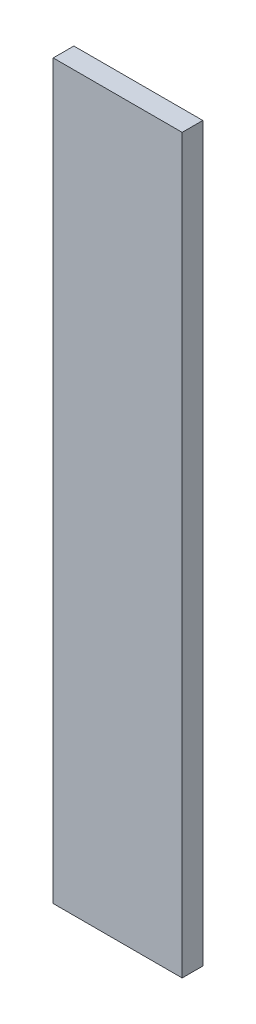
ISO-10303-21;
HEADER;
FILE_DESCRIPTION(('STEP AP214'),'2;1');
FILE_NAME('part.step','',(''),(''),'','','');
FILE_SCHEMA(('AUTOMOTIVE_DESIGN { 1 0 10303 214 1 1 1 1 }'));
ENDSEC;
DATA;
#1=APPLICATION_CONTEXT('core data for automotive mechanical design processes');
#2=APPLICATION_PROTOCOL_DEFINITION('international standard','automotive_design',2000,#1);
#3=PRODUCT_CONTEXT('',#1,'mechanical');
#4=PRODUCT('Part','Part','',(#3));
#5=PRODUCT_RELATED_PRODUCT_CATEGORY('part','',(#4));
#6=PRODUCT_DEFINITION_FORMATION('','',#4);
#7=PRODUCT_DEFINITION_CONTEXT('part definition',#1,'design');
#8=PRODUCT_DEFINITION('design','',#6,#7);
#9=PRODUCT_DEFINITION_SHAPE('','',#8);
#10=(LENGTH_UNIT() NAMED_UNIT(*) SI_UNIT(.MILLI.,.METRE.));
#11=(NAMED_UNIT(*) PLANE_ANGLE_UNIT() SI_UNIT($,.RADIAN.));
#12=(NAMED_UNIT(*) SI_UNIT($,.STERADIAN.) SOLID_ANGLE_UNIT());
#13=UNCERTAINTY_MEASURE_WITH_UNIT(LENGTH_MEASURE(1.E-05),#10,'distance_accuracy_value','');
#14=(GEOMETRIC_REPRESENTATION_CONTEXT(3) GLOBAL_UNCERTAINTY_ASSIGNED_CONTEXT((#13)) GLOBAL_UNIT_ASSIGNED_CONTEXT((#10,
#11,#12)) REPRESENTATION_CONTEXT('',''));
#15=CARTESIAN_POINT('',(0.,0.,0.));
#16=DIRECTION('',(0.,0.,1.));
#17=DIRECTION('',(1.,0.,0.));
#18=AXIS2_PLACEMENT_3D('',#15,#16,#17);
#19=CARTESIAN_POINT('',(0.,0.,8.));
#20=DIRECTION('',(1.,0.,0.));
#21=DIRECTION('',(0.,0.,-1.));
#22=AXIS2_PLACEMENT_3D('',#19,#20,#21);
#23=PLANE('',#22);
#24=DIRECTION('',(0.,-1.,0.));
#25=VECTOR('',#24,1.);
#26=CARTESIAN_POINT('',(0.,0.,0.));
#27=LINE('',#26,#25);
#28=CARTESIAN_POINT('',(0.,284.,0.));
#29=VERTEX_POINT('',#28);
#30=CARTESIAN_POINT('',(0.,0.,0.));
#31=VERTEX_POINT('',#30);
#32=EDGE_CURVE('E96',#29,#31,#27,.T.);
#33=ORIENTED_EDGE('',*,*,#32,.T.);
#34=DIRECTION('',(0.,0.,-1.));
#35=VECTOR('',#34,1.);
#36=CARTESIAN_POINT('',(0.,0.,8.));
#37=LINE('',#36,#35);
#38=CARTESIAN_POINT('',(0.,0.,8.));
#39=VERTEX_POINT('',#38);
#40=EDGE_CURVE('E11',#39,#31,#37,.T.);
#41=ORIENTED_EDGE('',*,*,#40,.F.);
#42=DIRECTION('',(0.,-1.,0.));
#43=VECTOR('',#42,1.);
#44=CARTESIAN_POINT('',(0.,0.,8.));
#45=LINE('',#44,#43);
#46=CARTESIAN_POINT('',(0.,284.,8.));
#47=VERTEX_POINT('',#46);
#48=EDGE_CURVE('E84',#47,#39,#45,.T.);
#49=ORIENTED_EDGE('',*,*,#48,.F.);
#50=DIRECTION('',(0.,0.,-1.));
#51=VECTOR('',#50,1.);
#52=CARTESIAN_POINT('',(0.,284.,8.));
#53=LINE('',#52,#51);
#54=EDGE_CURVE('E92',#47,#29,#53,.T.);
#55=ORIENTED_EDGE('',*,*,#54,.T.);
#56=EDGE_LOOP('',(#33,#41,#49,#55));
#57=FACE_BOUND('',#56,.T.);
#58=ADVANCED_FACE('F33',(#57),#23,.F.);
#59=CARTESIAN_POINT('',(0.,0.,8.));
#60=DIRECTION('',(0.,1.,0.));
#61=DIRECTION('',(0.,0.,1.));
#62=AXIS2_PLACEMENT_3D('',#59,#60,#61);
#63=PLANE('',#62);
#64=DIRECTION('',(1.,0.,0.));
#65=VECTOR('',#64,1.);
#66=CARTESIAN_POINT('',(0.,0.,0.));
#67=LINE('',#66,#65);
#68=CARTESIAN_POINT('',(50.,0.,0.));
#69=VERTEX_POINT('',#68);
#70=EDGE_CURVE('E88',#31,#69,#67,.T.);
#71=ORIENTED_EDGE('',*,*,#70,.T.);
#72=DIRECTION('',(0.,0.,-1.));
#73=VECTOR('',#72,1.);
#74=CARTESIAN_POINT('',(50.,0.,8.));
#75=LINE('',#74,#73);
#76=CARTESIAN_POINT('',(50.,0.,8.));
#77=VERTEX_POINT('',#76);
#78=EDGE_CURVE('E41',#77,#69,#75,.T.);
#79=ORIENTED_EDGE('',*,*,#78,.F.);
#80=DIRECTION('',(1.,0.,0.));
#81=VECTOR('',#80,1.);
#82=CARTESIAN_POINT('',(0.,0.,8.));
#83=LINE('',#82,#81);
#84=EDGE_CURVE('E79',#39,#77,#83,.T.);
#85=ORIENTED_EDGE('',*,*,#84,.F.);
#86=ORIENTED_EDGE('',*,*,#40,.T.);
#87=EDGE_LOOP('',(#71,#79,#85,#86));
#88=FACE_BOUND('',#87,.T.);
#89=ADVANCED_FACE('F87',(#88),#63,.F.);
#90=CARTESIAN_POINT('',(50.,0.,8.));
#91=DIRECTION('',(-1.,0.,0.));
#92=DIRECTION('',(0.,0.,1.));
#93=AXIS2_PLACEMENT_3D('',#90,#91,#92);
#94=PLANE('',#93);
#95=DIRECTION('',(0.,1.,0.));
#96=VECTOR('',#95,1.);
#97=CARTESIAN_POINT('',(50.,0.,0.));
#98=LINE('',#97,#96);
#99=CARTESIAN_POINT('',(50.,284.,0.));
#100=VERTEX_POINT('',#99);
#101=EDGE_CURVE('E66',#69,#100,#98,.T.);
#102=ORIENTED_EDGE('',*,*,#101,.T.);
#103=DIRECTION('',(0.,0.,-1.));
#104=VECTOR('',#103,1.);
#105=CARTESIAN_POINT('',(50.,284.,8.));
#106=LINE('',#105,#104);
#107=CARTESIAN_POINT('',(50.,284.,8.));
#108=VERTEX_POINT('',#107);
#109=EDGE_CURVE('E89',#108,#100,#106,.T.);
#110=ORIENTED_EDGE('',*,*,#109,.F.);
#111=DIRECTION('',(0.,1.,0.));
#112=VECTOR('',#111,1.);
#113=CARTESIAN_POINT('',(50.,0.,8.));
#114=LINE('',#113,#112);
#115=EDGE_CURVE('E82',#77,#108,#114,.T.);
#116=ORIENTED_EDGE('',*,*,#115,.F.);
#117=ORIENTED_EDGE('',*,*,#78,.T.);
#118=EDGE_LOOP('',(#102,#110,#116,#117));
#119=FACE_BOUND('',#118,.T.);
#120=ADVANCED_FACE('F90',(#119),#94,.F.);
#121=CARTESIAN_POINT('',(0.,284.,8.));
#122=DIRECTION('',(0.,-1.,0.));
#123=DIRECTION('',(0.,0.,-1.));
#124=AXIS2_PLACEMENT_3D('',#121,#122,#123);
#125=PLANE('',#124);
#126=DIRECTION('',(-1.,0.,0.));
#127=VECTOR('',#126,1.);
#128=CARTESIAN_POINT('',(0.,284.,0.));
#129=LINE('',#128,#127);
#130=EDGE_CURVE('E72',#100,#29,#129,.T.);
#131=ORIENTED_EDGE('',*,*,#130,.T.);
#132=ORIENTED_EDGE('',*,*,#54,.F.);
#133=DIRECTION('',(-1.,0.,0.));
#134=VECTOR('',#133,1.);
#135=CARTESIAN_POINT('',(0.,284.,8.));
#136=LINE('',#135,#134);
#137=EDGE_CURVE('E49',#108,#47,#136,.T.);
#138=ORIENTED_EDGE('',*,*,#137,.F.);
#139=ORIENTED_EDGE('',*,*,#109,.T.);
#140=EDGE_LOOP('',(#131,#132,#138,#139));
#141=FACE_BOUND('',#140,.T.);
#142=ADVANCED_FACE('F103',(#141),#125,.F.);
#143=CARTESIAN_POINT('',(0.,0.,8.));
#144=DIRECTION('',(0.,0.,-1.));
#145=DIRECTION('',(-1.,0.,0.));
#146=AXIS2_PLACEMENT_3D('',#143,#144,#145);
#147=PLANE('',#146);
#148=ORIENTED_EDGE('',*,*,#48,.T.);
#149=ORIENTED_EDGE('',*,*,#84,.T.);
#150=ORIENTED_EDGE('',*,*,#115,.T.);
#151=ORIENTED_EDGE('',*,*,#137,.T.);
#152=EDGE_LOOP('',(#148,#149,#150,#151));
#153=FACE_BOUND('',#152,.T.);
#154=ADVANCED_FACE('F80',(#153),#147,.F.);
#155=CARTESIAN_POINT('',(0.,0.,0.));
#156=DIRECTION('',(0.,0.,-1.));
#157=DIRECTION('',(-1.,0.,0.));
#158=AXIS2_PLACEMENT_3D('',#155,#156,#157);
#159=PLANE('',#158);
#160=ORIENTED_EDGE('',*,*,#32,.F.);
#161=ORIENTED_EDGE('',*,*,#130,.F.);
#162=ORIENTED_EDGE('',*,*,#101,.F.);
#163=ORIENTED_EDGE('',*,*,#70,.F.);
#164=EDGE_LOOP('',(#160,#161,#162,#163));
#165=FACE_BOUND('',#164,.T.);
#166=ADVANCED_FACE('F106',(#165),#159,.T.);
#167=CLOSED_SHELL('',(#58,#89,#120,#142,#154,#166));
#168=MANIFOLD_SOLID_BREP('B2',#167);
#169=ADVANCED_BREP_SHAPE_REPRESENTATION('',(#18,#168),#14);
#170=SHAPE_DEFINITION_REPRESENTATION(#9,#169);
ENDSEC;
END-ISO-10303-21;
